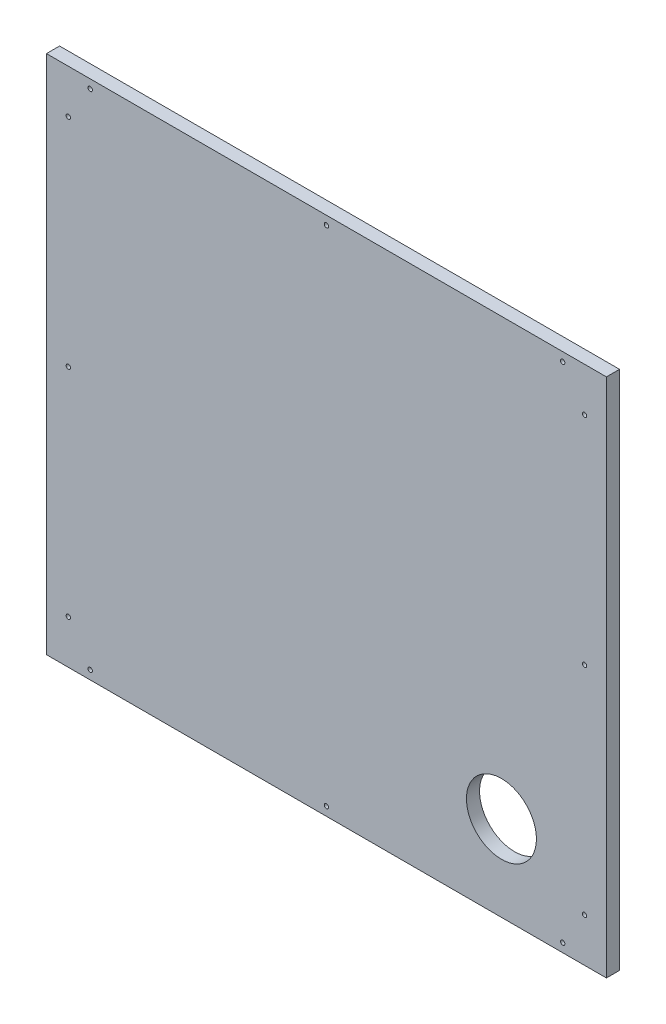
ISO-10303-21;
HEADER;
FILE_DESCRIPTION(('STEP AP214'),'2;1');
FILE_NAME('part.step','',(''),(''),'','','');
FILE_SCHEMA(('AUTOMOTIVE_DESIGN { 1 0 10303 214 1 1 1 1 }'));
ENDSEC;
DATA;
#1=APPLICATION_CONTEXT('core data for automotive mechanical design processes');
#2=APPLICATION_PROTOCOL_DEFINITION('international standard','automotive_design',2000,#1);
#3=PRODUCT_CONTEXT('',#1,'mechanical');
#4=PRODUCT('Part','Part','',(#3));
#5=PRODUCT_RELATED_PRODUCT_CATEGORY('part','',(#4));
#6=PRODUCT_DEFINITION_FORMATION('','',#4);
#7=PRODUCT_DEFINITION_CONTEXT('part definition',#1,'design');
#8=PRODUCT_DEFINITION('design','',#6,#7);
#9=PRODUCT_DEFINITION_SHAPE('','',#8);
#10=(LENGTH_UNIT() NAMED_UNIT(*) SI_UNIT(.MILLI.,.METRE.));
#11=(NAMED_UNIT(*) PLANE_ANGLE_UNIT() SI_UNIT($,.RADIAN.));
#12=(NAMED_UNIT(*) SI_UNIT($,.STERADIAN.) SOLID_ANGLE_UNIT());
#13=UNCERTAINTY_MEASURE_WITH_UNIT(LENGTH_MEASURE(1.E-05),#10,'distance_accuracy_value','');
#14=(GEOMETRIC_REPRESENTATION_CONTEXT(3) GLOBAL_UNCERTAINTY_ASSIGNED_CONTEXT((#13)) GLOBAL_UNIT_ASSIGNED_CONTEXT((#10,
#11,#12)) REPRESENTATION_CONTEXT('',''));
#15=CARTESIAN_POINT('',(0.,0.,0.));
#16=DIRECTION('',(0.,0.,1.));
#17=DIRECTION('',(1.,0.,0.));
#18=AXIS2_PLACEMENT_3D('',#15,#16,#17);
#19=CARTESIAN_POINT('',(320.,297.5,15.));
#20=DIRECTION('',(-1.,0.,0.));
#21=DIRECTION('',(0.,-1.,0.));
#22=AXIS2_PLACEMENT_3D('',#19,#20,#21);
#23=PLANE('',#22);
#24=DIRECTION('',(0.,1.,0.));
#25=VECTOR('',#24,1.);
#26=CARTESIAN_POINT('',(320.,297.5,0.));
#27=LINE('',#26,#25);
#28=CARTESIAN_POINT('',(320.,-297.5,0.));
#29=VERTEX_POINT('',#28);
#30=CARTESIAN_POINT('',(320.,297.5,0.));
#31=VERTEX_POINT('',#30);
#32=EDGE_CURVE('E100',#29,#31,#27,.T.);
#33=ORIENTED_EDGE('',*,*,#32,.T.);
#34=DIRECTION('',(0.,0.,-1.));
#35=VECTOR('',#34,1.);
#36=CARTESIAN_POINT('',(320.,297.5,15.));
#37=LINE('',#36,#35);
#38=CARTESIAN_POINT('',(320.,297.5,15.));
#39=VERTEX_POINT('',#38);
#40=EDGE_CURVE('E11',#39,#31,#37,.T.);
#41=ORIENTED_EDGE('',*,*,#40,.F.);
#42=DIRECTION('',(0.,1.,0.));
#43=VECTOR('',#42,1.);
#44=CARTESIAN_POINT('',(320.,297.5,15.));
#45=LINE('',#44,#43);
#46=CARTESIAN_POINT('',(320.,-297.5,15.));
#47=VERTEX_POINT('',#46);
#48=EDGE_CURVE('E88',#47,#39,#45,.T.);
#49=ORIENTED_EDGE('',*,*,#48,.F.);
#50=DIRECTION('',(0.,0.,-1.));
#51=VECTOR('',#50,1.);
#52=CARTESIAN_POINT('',(320.,-297.5,15.));
#53=LINE('',#52,#51);
#54=EDGE_CURVE('E96',#47,#29,#53,.T.);
#55=ORIENTED_EDGE('',*,*,#54,.T.);
#56=EDGE_LOOP('',(#33,#41,#49,#55));
#57=FACE_BOUND('',#56,.T.);
#58=ADVANCED_FACE('F37',(#57),#23,.F.);
#59=CARTESIAN_POINT('',(-320.,297.5,15.));
#60=DIRECTION('',(0.,-1.,0.));
#61=DIRECTION('',(0.,0.,-1.));
#62=AXIS2_PLACEMENT_3D('',#59,#60,#61);
#63=PLANE('',#62);
#64=DIRECTION('',(-1.,0.,0.));
#65=VECTOR('',#64,1.);
#66=CARTESIAN_POINT('',(-320.,297.5,0.));
#67=LINE('',#66,#65);
#68=CARTESIAN_POINT('',(-320.,297.5,0.));
#69=VERTEX_POINT('',#68);
#70=EDGE_CURVE('E92',#31,#69,#67,.T.);
#71=ORIENTED_EDGE('',*,*,#70,.T.);
#72=DIRECTION('',(0.,0.,-1.));
#73=VECTOR('',#72,1.);
#74=CARTESIAN_POINT('',(-320.,297.5,15.));
#75=LINE('',#74,#73);
#76=CARTESIAN_POINT('',(-320.,297.5,15.));
#77=VERTEX_POINT('',#76);
#78=EDGE_CURVE('E45',#77,#69,#75,.T.);
#79=ORIENTED_EDGE('',*,*,#78,.F.);
#80=DIRECTION('',(-1.,0.,0.));
#81=VECTOR('',#80,1.);
#82=CARTESIAN_POINT('',(-320.,297.5,15.));
#83=LINE('',#82,#81);
#84=EDGE_CURVE('E83',#39,#77,#83,.T.);
#85=ORIENTED_EDGE('',*,*,#84,.F.);
#86=ORIENTED_EDGE('',*,*,#40,.T.);
#87=EDGE_LOOP('',(#71,#79,#85,#86));
#88=FACE_BOUND('',#87,.T.);
#89=ADVANCED_FACE('F91',(#88),#63,.F.);
#90=CARTESIAN_POINT('',(-320.,297.5,15.));
#91=DIRECTION('',(1.,0.,0.));
#92=DIRECTION('',(0.,0.,-1.));
#93=AXIS2_PLACEMENT_3D('',#90,#91,#92);
#94=PLANE('',#93);
#95=DIRECTION('',(0.,-1.,0.));
#96=VECTOR('',#95,1.);
#97=CARTESIAN_POINT('',(-320.,297.5,0.));
#98=LINE('',#97,#96);
#99=CARTESIAN_POINT('',(-320.,-297.5,0.));
#100=VERTEX_POINT('',#99);
#101=EDGE_CURVE('E70',#69,#100,#98,.T.);
#102=ORIENTED_EDGE('',*,*,#101,.T.);
#103=DIRECTION('',(0.,0.,-1.));
#104=VECTOR('',#103,1.);
#105=CARTESIAN_POINT('',(-320.,-297.5,15.));
#106=LINE('',#105,#104);
#107=CARTESIAN_POINT('',(-320.,-297.5,15.));
#108=VERTEX_POINT('',#107);
#109=EDGE_CURVE('E93',#108,#100,#106,.T.);
#110=ORIENTED_EDGE('',*,*,#109,.F.);
#111=DIRECTION('',(0.,-1.,0.));
#112=VECTOR('',#111,1.);
#113=CARTESIAN_POINT('',(-320.,297.5,15.));
#114=LINE('',#113,#112);
#115=EDGE_CURVE('E86',#77,#108,#114,.T.);
#116=ORIENTED_EDGE('',*,*,#115,.F.);
#117=ORIENTED_EDGE('',*,*,#78,.T.);
#118=EDGE_LOOP('',(#102,#110,#116,#117));
#119=FACE_BOUND('',#118,.T.);
#120=ADVANCED_FACE('F94',(#119),#94,.F.);
#121=CARTESIAN_POINT('',(-320.,-297.5,15.));
#122=DIRECTION('',(0.,1.,0.));
#123=DIRECTION('',(0.,0.,1.));
#124=AXIS2_PLACEMENT_3D('',#121,#122,#123);
#125=PLANE('',#124);
#126=DIRECTION('',(1.,0.,0.));
#127=VECTOR('',#126,1.);
#128=CARTESIAN_POINT('',(-320.,-297.5,0.));
#129=LINE('',#128,#127);
#130=EDGE_CURVE('E76',#100,#29,#129,.T.);
#131=ORIENTED_EDGE('',*,*,#130,.T.);
#132=ORIENTED_EDGE('',*,*,#54,.F.);
#133=DIRECTION('',(1.,0.,0.));
#134=VECTOR('',#133,1.);
#135=CARTESIAN_POINT('',(-320.,-297.5,15.));
#136=LINE('',#135,#134);
#137=EDGE_CURVE('E53',#108,#47,#136,.T.);
#138=ORIENTED_EDGE('',*,*,#137,.F.);
#139=ORIENTED_EDGE('',*,*,#109,.T.);
#140=EDGE_LOOP('',(#131,#132,#138,#139));
#141=FACE_BOUND('',#140,.T.);
#142=ADVANCED_FACE('F108',(#141),#125,.F.);
#143=CARTESIAN_POINT('',(0.,0.,15.));
#144=DIRECTION('',(0.,0.,1.));
#145=DIRECTION('',(1.,0.,0.));
#146=AXIS2_PLACEMENT_3D('',#143,#144,#145);
#147=PLANE('',#146);
#148=CARTESIAN_POINT('',(200.,-200.,15.));
#149=DIRECTION('',(0.,0.,1.));
#150=DIRECTION('',(1.,0.,0.));
#151=AXIS2_PLACEMENT_3D('',#148,#149,#150);
#152=CIRCLE('',#151,40.);
#153=CARTESIAN_POINT('',(240.,-200.,15.));
#154=VERTEX_POINT('',#153);
#155=EDGE_CURVE('E186',#154,#154,#152,.T.);
#156=ORIENTED_EDGE('',*,*,#155,.F.);
#157=EDGE_LOOP('',(#156));
#158=FACE_BOUND('',#157,.T.);
#159=CARTESIAN_POINT('',(295.,247.5,15.));
#160=DIRECTION('',(0.,0.,-1.));
#161=DIRECTION('',(-1.,0.,0.));
#162=AXIS2_PLACEMENT_3D('',#159,#160,#161);
#163=CIRCLE('',#162,2.50000000000002);
#164=CARTESIAN_POINT('',(292.5,247.5,15.));
#165=VERTEX_POINT('',#164);
#166=EDGE_CURVE('E181',#165,#165,#163,.T.);
#167=ORIENTED_EDGE('',*,*,#166,.T.);
#168=EDGE_LOOP('',(#167));
#169=FACE_BOUND('',#168,.T.);
#170=CARTESIAN_POINT('',(295.,0.,15.));
#171=DIRECTION('',(0.,0.,-1.));
#172=DIRECTION('',(-1.,0.,0.));
#173=AXIS2_PLACEMENT_3D('',#170,#171,#172);
#174=CIRCLE('',#173,2.50000000000002);
#175=CARTESIAN_POINT('',(292.5,0.,15.));
#176=VERTEX_POINT('',#175);
#177=EDGE_CURVE('E175',#176,#176,#174,.T.);
#178=ORIENTED_EDGE('',*,*,#177,.T.);
#179=EDGE_LOOP('',(#178));
#180=FACE_BOUND('',#179,.T.);
#181=CARTESIAN_POINT('',(295.,-247.5,15.));
#182=DIRECTION('',(0.,0.,-1.));
#183=DIRECTION('',(-1.,0.,0.));
#184=AXIS2_PLACEMENT_3D('',#181,#182,#183);
#185=CIRCLE('',#184,2.50000000000002);
#186=CARTESIAN_POINT('',(292.5,-247.5,15.));
#187=VERTEX_POINT('',#186);
#188=EDGE_CURVE('E168',#187,#187,#185,.T.);
#189=ORIENTED_EDGE('',*,*,#188,.T.);
#190=EDGE_LOOP('',(#189));
#191=FACE_BOUND('',#190,.T.);
#192=CARTESIAN_POINT('',(-270.,-287.5,15.));
#193=DIRECTION('',(0.,0.,-1.));
#194=DIRECTION('',(1.,0.,0.));
#195=AXIS2_PLACEMENT_3D('',#192,#193,#194);
#196=CIRCLE('',#195,2.50000000000002);
#197=CARTESIAN_POINT('',(-267.5,-287.5,15.));
#198=VERTEX_POINT('',#197);
#199=EDGE_CURVE('E163',#198,#198,#196,.T.);
#200=ORIENTED_EDGE('',*,*,#199,.T.);
#201=EDGE_LOOP('',(#200));
#202=FACE_BOUND('',#201,.T.);
#203=CARTESIAN_POINT('',(0.,-287.5,15.));
#204=DIRECTION('',(0.,0.,-1.));
#205=DIRECTION('',(1.,0.,0.));
#206=AXIS2_PLACEMENT_3D('',#203,#204,#205);
#207=CIRCLE('',#206,2.5);
#208=CARTESIAN_POINT('',(2.5,-287.5,15.));
#209=VERTEX_POINT('',#208);
#210=EDGE_CURVE('E157',#209,#209,#207,.T.);
#211=ORIENTED_EDGE('',*,*,#210,.T.);
#212=EDGE_LOOP('',(#211));
#213=FACE_BOUND('',#212,.T.);
#214=CARTESIAN_POINT('',(270.,-287.5,15.));
#215=DIRECTION('',(0.,0.,-1.));
#216=DIRECTION('',(1.,0.,0.));
#217=AXIS2_PLACEMENT_3D('',#214,#215,#216);
#218=CIRCLE('',#217,2.50000000000002);
#219=CARTESIAN_POINT('',(272.5,-287.5,15.));
#220=VERTEX_POINT('',#219);
#221=EDGE_CURVE('E150',#220,#220,#218,.T.);
#222=ORIENTED_EDGE('',*,*,#221,.T.);
#223=EDGE_LOOP('',(#222));
#224=FACE_BOUND('',#223,.T.);
#225=CARTESIAN_POINT('',(-295.,247.5,15.));
#226=DIRECTION('',(0.,0.,1.));
#227=DIRECTION('',(1.,0.,0.));
#228=AXIS2_PLACEMENT_3D('',#225,#226,#227);
#229=CIRCLE('',#228,2.50000000000002);
#230=CARTESIAN_POINT('',(-292.5,247.5,15.));
#231=VERTEX_POINT('',#230);
#232=EDGE_CURVE('E145',#231,#231,#229,.T.);
#233=ORIENTED_EDGE('',*,*,#232,.F.);
#234=EDGE_LOOP('',(#233));
#235=FACE_BOUND('',#234,.T.);
#236=CARTESIAN_POINT('',(-295.,0.,15.));
#237=DIRECTION('',(0.,0.,1.));
#238=DIRECTION('',(1.,0.,0.));
#239=AXIS2_PLACEMENT_3D('',#236,#237,#238);
#240=CIRCLE('',#239,2.50000000000002);
#241=CARTESIAN_POINT('',(-292.5,0.,15.));
#242=VERTEX_POINT('',#241);
#243=EDGE_CURVE('E142',#242,#242,#240,.T.);
#244=ORIENTED_EDGE('',*,*,#243,.F.);
#245=EDGE_LOOP('',(#244));
#246=FACE_BOUND('',#245,.T.);
#247=CARTESIAN_POINT('',(-295.,-247.5,15.));
#248=DIRECTION('',(0.,0.,1.));
#249=DIRECTION('',(1.,0.,0.));
#250=AXIS2_PLACEMENT_3D('',#247,#248,#249);
#251=CIRCLE('',#250,2.50000000000002);
#252=CARTESIAN_POINT('',(-292.5,-247.5,15.));
#253=VERTEX_POINT('',#252);
#254=EDGE_CURVE('E135',#253,#253,#251,.T.);
#255=ORIENTED_EDGE('',*,*,#254,.F.);
#256=EDGE_LOOP('',(#255));
#257=FACE_BOUND('',#256,.T.);
#258=CARTESIAN_POINT('',(-270.,287.5,15.));
#259=DIRECTION('',(0.,0.,1.));
#260=DIRECTION('',(1.,0.,0.));
#261=AXIS2_PLACEMENT_3D('',#258,#259,#260);
#262=CIRCLE('',#261,2.50000000000002);
#263=CARTESIAN_POINT('',(-267.5,287.5,15.));
#264=VERTEX_POINT('',#263);
#265=EDGE_CURVE('E127',#264,#264,#262,.T.);
#266=ORIENTED_EDGE('',*,*,#265,.F.);
#267=EDGE_LOOP('',(#266));
#268=FACE_BOUND('',#267,.T.);
#269=CARTESIAN_POINT('',(0.,287.5,15.));
#270=DIRECTION('',(0.,0.,1.));
#271=DIRECTION('',(1.,0.,0.));
#272=AXIS2_PLACEMENT_3D('',#269,#270,#271);
#273=CIRCLE('',#272,2.5);
#274=CARTESIAN_POINT('',(2.5,287.5,15.));
#275=VERTEX_POINT('',#274);
#276=EDGE_CURVE('E124',#275,#275,#273,.T.);
#277=ORIENTED_EDGE('',*,*,#276,.F.);
#278=EDGE_LOOP('',(#277));
#279=FACE_BOUND('',#278,.T.);
#280=CARTESIAN_POINT('',(270.,287.5,15.));
#281=DIRECTION('',(0.,0.,1.));
#282=DIRECTION('',(1.,0.,0.));
#283=AXIS2_PLACEMENT_3D('',#280,#281,#282);
#284=CIRCLE('',#283,2.50000000000002);
#285=CARTESIAN_POINT('',(272.5,287.5,15.));
#286=VERTEX_POINT('',#285);
#287=EDGE_CURVE('E117',#286,#286,#284,.T.);
#288=ORIENTED_EDGE('',*,*,#287,.F.);
#289=EDGE_LOOP('',(#288));
#290=FACE_BOUND('',#289,.T.);
#291=ORIENTED_EDGE('',*,*,#48,.T.);
#292=ORIENTED_EDGE('',*,*,#84,.T.);
#293=ORIENTED_EDGE('',*,*,#115,.T.);
#294=ORIENTED_EDGE('',*,*,#137,.T.);
#295=EDGE_LOOP('',(#291,#292,#293,#294));
#296=FACE_BOUND('',#295,.T.);
#297=ADVANCED_FACE('F84',(#158,#169,#180,#191,#202,#213,#224,#235,#246,#257,#268,#279,#290,
#296),#147,.T.);
#298=CARTESIAN_POINT('',(0.,0.,0.));
#299=DIRECTION('',(0.,0.,1.));
#300=DIRECTION('',(1.,0.,0.));
#301=AXIS2_PLACEMENT_3D('',#298,#299,#300);
#302=PLANE('',#301);
#303=CARTESIAN_POINT('',(200.,-200.,0.));
#304=DIRECTION('',(0.,0.,1.));
#305=DIRECTION('',(1.,0.,0.));
#306=AXIS2_PLACEMENT_3D('',#303,#304,#305);
#307=CIRCLE('',#306,40.);
#308=CARTESIAN_POINT('',(240.,-200.,0.));
#309=VERTEX_POINT('',#308);
#310=EDGE_CURVE('E172',#309,#309,#307,.T.);
#311=ORIENTED_EDGE('',*,*,#310,.T.);
#312=EDGE_LOOP('',(#311));
#313=FACE_BOUND('',#312,.T.);
#314=CARTESIAN_POINT('',(295.,247.5,0.));
#315=DIRECTION('',(0.,0.,-1.));
#316=DIRECTION('',(-1.,0.,0.));
#317=AXIS2_PLACEMENT_3D('',#314,#315,#316);
#318=CIRCLE('',#317,2.50000000000002);
#319=CARTESIAN_POINT('',(292.5,247.5,0.));
#320=VERTEX_POINT('',#319);
#321=EDGE_CURVE('E154',#320,#320,#318,.T.);
#322=ORIENTED_EDGE('',*,*,#321,.F.);
#323=EDGE_LOOP('',(#322));
#324=FACE_BOUND('',#323,.T.);
#325=CARTESIAN_POINT('',(295.,0.,0.));
#326=DIRECTION('',(0.,0.,-1.));
#327=DIRECTION('',(-1.,0.,0.));
#328=AXIS2_PLACEMENT_3D('',#325,#326,#327);
#329=CIRCLE('',#328,2.50000000000002);
#330=CARTESIAN_POINT('',(292.5,0.,0.));
#331=VERTEX_POINT('',#330);
#332=EDGE_CURVE('E178',#331,#331,#329,.T.);
#333=ORIENTED_EDGE('',*,*,#332,.F.);
#334=EDGE_LOOP('',(#333));
#335=FACE_BOUND('',#334,.T.);
#336=CARTESIAN_POINT('',(295.,-247.5,0.));
#337=DIRECTION('',(0.,0.,-1.));
#338=DIRECTION('',(-1.,0.,0.));
#339=AXIS2_PLACEMENT_3D('',#336,#337,#338);
#340=CIRCLE('',#339,2.50000000000002);
#341=CARTESIAN_POINT('',(292.5,-247.5,0.));
#342=VERTEX_POINT('',#341);
#343=EDGE_CURVE('E171',#342,#342,#340,.T.);
#344=ORIENTED_EDGE('',*,*,#343,.F.);
#345=EDGE_LOOP('',(#344));
#346=FACE_BOUND('',#345,.T.);
#347=CARTESIAN_POINT('',(-270.,-287.5,0.));
#348=DIRECTION('',(0.,0.,-1.));
#349=DIRECTION('',(1.,0.,0.));
#350=AXIS2_PLACEMENT_3D('',#347,#348,#349);
#351=CIRCLE('',#350,2.50000000000002);
#352=CARTESIAN_POINT('',(-267.5,-287.5,0.));
#353=VERTEX_POINT('',#352);
#354=EDGE_CURVE('E136',#353,#353,#351,.T.);
#355=ORIENTED_EDGE('',*,*,#354,.F.);
#356=EDGE_LOOP('',(#355));
#357=FACE_BOUND('',#356,.T.);
#358=CARTESIAN_POINT('',(0.,-287.5,0.));
#359=DIRECTION('',(0.,0.,-1.));
#360=DIRECTION('',(1.,0.,0.));
#361=AXIS2_PLACEMENT_3D('',#358,#359,#360);
#362=CIRCLE('',#361,2.5);
#363=CARTESIAN_POINT('',(2.5,-287.5,0.));
#364=VERTEX_POINT('',#363);
#365=EDGE_CURVE('E160',#364,#364,#362,.T.);
#366=ORIENTED_EDGE('',*,*,#365,.F.);
#367=EDGE_LOOP('',(#366));
#368=FACE_BOUND('',#367,.T.);
#369=CARTESIAN_POINT('',(270.,-287.5,0.));
#370=DIRECTION('',(0.,0.,-1.));
#371=DIRECTION('',(1.,0.,0.));
#372=AXIS2_PLACEMENT_3D('',#369,#370,#371);
#373=CIRCLE('',#372,2.50000000000002);
#374=CARTESIAN_POINT('',(272.5,-287.5,0.));
#375=VERTEX_POINT('',#374);
#376=EDGE_CURVE('E153',#375,#375,#373,.T.);
#377=ORIENTED_EDGE('',*,*,#376,.F.);
#378=EDGE_LOOP('',(#377));
#379=FACE_BOUND('',#378,.T.);
#380=CARTESIAN_POINT('',(-295.,247.5,0.));
#381=DIRECTION('',(0.,0.,1.));
#382=DIRECTION('',(1.,0.,0.));
#383=AXIS2_PLACEMENT_3D('',#380,#381,#382);
#384=CIRCLE('',#383,2.50000000000002);
#385=CARTESIAN_POINT('',(-292.5,247.5,0.));
#386=VERTEX_POINT('',#385);
#387=EDGE_CURVE('E118',#386,#386,#384,.T.);
#388=ORIENTED_EDGE('',*,*,#387,.T.);
#389=EDGE_LOOP('',(#388));
#390=FACE_BOUND('',#389,.T.);
#391=CARTESIAN_POINT('',(-295.,0.,0.));
#392=DIRECTION('',(0.,0.,1.));
#393=DIRECTION('',(1.,0.,0.));
#394=AXIS2_PLACEMENT_3D('',#391,#392,#393);
#395=CIRCLE('',#394,2.50000000000002);
#396=CARTESIAN_POINT('',(-292.5,0.,0.));
#397=VERTEX_POINT('',#396);
#398=EDGE_CURVE('E139',#397,#397,#395,.T.);
#399=ORIENTED_EDGE('',*,*,#398,.T.);
#400=EDGE_LOOP('',(#399));
#401=FACE_BOUND('',#400,.T.);
#402=CARTESIAN_POINT('',(-295.,-247.5,0.));
#403=DIRECTION('',(0.,0.,1.));
#404=DIRECTION('',(1.,0.,0.));
#405=AXIS2_PLACEMENT_3D('',#402,#403,#404);
#406=CIRCLE('',#405,2.50000000000002);
#407=CARTESIAN_POINT('',(-292.5,-247.5,0.));
#408=VERTEX_POINT('',#407);
#409=EDGE_CURVE('E132',#408,#408,#406,.T.);
#410=ORIENTED_EDGE('',*,*,#409,.T.);
#411=EDGE_LOOP('',(#410));
#412=FACE_BOUND('',#411,.T.);
#413=CARTESIAN_POINT('',(-270.,287.5,0.));
#414=DIRECTION('',(0.,0.,1.));
#415=DIRECTION('',(1.,0.,0.));
#416=AXIS2_PLACEMENT_3D('',#413,#414,#415);
#417=CIRCLE('',#416,2.50000000000002);
#418=CARTESIAN_POINT('',(-267.5,287.5,0.));
#419=VERTEX_POINT('',#418);
#420=EDGE_CURVE('E103',#419,#419,#417,.T.);
#421=ORIENTED_EDGE('',*,*,#420,.T.);
#422=EDGE_LOOP('',(#421));
#423=FACE_BOUND('',#422,.T.);
#424=CARTESIAN_POINT('',(0.,287.5,0.));
#425=DIRECTION('',(0.,0.,1.));
#426=DIRECTION('',(1.,0.,0.));
#427=AXIS2_PLACEMENT_3D('',#424,#425,#426);
#428=CIRCLE('',#427,2.5);
#429=CARTESIAN_POINT('',(2.5,287.5,0.));
#430=VERTEX_POINT('',#429);
#431=EDGE_CURVE('E121',#430,#430,#428,.T.);
#432=ORIENTED_EDGE('',*,*,#431,.T.);
#433=EDGE_LOOP('',(#432));
#434=FACE_BOUND('',#433,.T.);
#435=CARTESIAN_POINT('',(270.,287.5,0.));
#436=DIRECTION('',(0.,0.,1.));
#437=DIRECTION('',(1.,0.,0.));
#438=AXIS2_PLACEMENT_3D('',#435,#436,#437);
#439=CIRCLE('',#438,2.50000000000002);
#440=CARTESIAN_POINT('',(272.5,287.5,0.));
#441=VERTEX_POINT('',#440);
#442=EDGE_CURVE('E114',#441,#441,#439,.T.);
#443=ORIENTED_EDGE('',*,*,#442,.T.);
#444=EDGE_LOOP('',(#443));
#445=FACE_BOUND('',#444,.T.);
#446=ORIENTED_EDGE('',*,*,#32,.F.);
#447=ORIENTED_EDGE('',*,*,#130,.F.);
#448=ORIENTED_EDGE('',*,*,#101,.F.);
#449=ORIENTED_EDGE('',*,*,#70,.F.);
#450=EDGE_LOOP('',(#446,#447,#448,#449));
#451=FACE_BOUND('',#450,.T.);
#452=ADVANCED_FACE('F111',(#313,#324,#335,#346,#357,#368,#379,#390,#401,#412,#423,#434,#445,
#451),#302,.F.);
#453=CARTESIAN_POINT('',(270.,287.5,0.));
#454=DIRECTION('',(0.,0.,1.));
#455=DIRECTION('',(1.,0.,0.));
#456=AXIS2_PLACEMENT_3D('',#453,#454,#455);
#457=CYLINDRICAL_SURFACE('',#456,2.50000000000002);
#458=ORIENTED_EDGE('',*,*,#442,.F.);
#459=EDGE_LOOP('',(#458));
#460=FACE_BOUND('',#459,.T.);
#461=ORIENTED_EDGE('',*,*,#287,.T.);
#462=EDGE_LOOP('',(#461));
#463=FACE_BOUND('',#462,.T.);
#464=ADVANCED_FACE('F228',(#460,#463),#457,.F.);
#465=CARTESIAN_POINT('',(0.,287.5,0.));
#466=DIRECTION('',(0.,0.,1.));
#467=DIRECTION('',(1.,0.,0.));
#468=AXIS2_PLACEMENT_3D('',#465,#466,#467);
#469=CYLINDRICAL_SURFACE('',#468,2.5);
#470=ORIENTED_EDGE('',*,*,#431,.F.);
#471=EDGE_LOOP('',(#470));
#472=FACE_BOUND('',#471,.T.);
#473=ORIENTED_EDGE('',*,*,#276,.T.);
#474=EDGE_LOOP('',(#473));
#475=FACE_BOUND('',#474,.T.);
#476=ADVANCED_FACE('F230',(#472,#475),#469,.F.);
#477=CARTESIAN_POINT('',(-270.,287.5,0.));
#478=DIRECTION('',(0.,0.,1.));
#479=DIRECTION('',(1.,0.,0.));
#480=AXIS2_PLACEMENT_3D('',#477,#478,#479);
#481=CYLINDRICAL_SURFACE('',#480,2.50000000000002);
#482=ORIENTED_EDGE('',*,*,#420,.F.);
#483=EDGE_LOOP('',(#482));
#484=FACE_BOUND('',#483,.T.);
#485=ORIENTED_EDGE('',*,*,#265,.T.);
#486=EDGE_LOOP('',(#485));
#487=FACE_BOUND('',#486,.T.);
#488=ADVANCED_FACE('F237',(#484,#487),#481,.F.);
#489=CARTESIAN_POINT('',(-295.,-247.5,0.));
#490=DIRECTION('',(0.,0.,1.));
#491=DIRECTION('',(1.,0.,0.));
#492=AXIS2_PLACEMENT_3D('',#489,#490,#491);
#493=CYLINDRICAL_SURFACE('',#492,2.50000000000002);
#494=ORIENTED_EDGE('',*,*,#409,.F.);
#495=EDGE_LOOP('',(#494));
#496=FACE_BOUND('',#495,.T.);
#497=ORIENTED_EDGE('',*,*,#254,.T.);
#498=EDGE_LOOP('',(#497));
#499=FACE_BOUND('',#498,.T.);
#500=ADVANCED_FACE('F337',(#496,#499),#493,.F.);
#501=CARTESIAN_POINT('',(-295.,0.,0.));
#502=DIRECTION('',(0.,0.,1.));
#503=DIRECTION('',(1.,0.,0.));
#504=AXIS2_PLACEMENT_3D('',#501,#502,#503);
#505=CYLINDRICAL_SURFACE('',#504,2.50000000000002);
#506=ORIENTED_EDGE('',*,*,#398,.F.);
#507=EDGE_LOOP('',(#506));
#508=FACE_BOUND('',#507,.T.);
#509=ORIENTED_EDGE('',*,*,#243,.T.);
#510=EDGE_LOOP('',(#509));
#511=FACE_BOUND('',#510,.T.);
#512=ADVANCED_FACE('F329',(#508,#511),#505,.F.);
#513=CARTESIAN_POINT('',(-295.,247.5,0.));
#514=DIRECTION('',(0.,0.,1.));
#515=DIRECTION('',(1.,0.,0.));
#516=AXIS2_PLACEMENT_3D('',#513,#514,#515);
#517=CYLINDRICAL_SURFACE('',#516,2.50000000000002);
#518=ORIENTED_EDGE('',*,*,#387,.F.);
#519=EDGE_LOOP('',(#518));
#520=FACE_BOUND('',#519,.T.);
#521=ORIENTED_EDGE('',*,*,#232,.T.);
#522=EDGE_LOOP('',(#521));
#523=FACE_BOUND('',#522,.T.);
#524=ADVANCED_FACE('F321',(#520,#523),#517,.F.);
#525=CARTESIAN_POINT('',(270.,-287.5,0.));
#526=DIRECTION('',(0.,0.,1.));
#527=DIRECTION('',(1.,0.,0.));
#528=AXIS2_PLACEMENT_3D('',#525,#526,#527);
#529=CYLINDRICAL_SURFACE('',#528,2.50000000000002);
#530=ORIENTED_EDGE('',*,*,#376,.T.);
#531=EDGE_LOOP('',(#530));
#532=FACE_BOUND('',#531,.T.);
#533=ORIENTED_EDGE('',*,*,#221,.F.);
#534=EDGE_LOOP('',(#533));
#535=FACE_BOUND('',#534,.T.);
#536=ADVANCED_FACE('F313',(#532,#535),#529,.F.);
#537=CARTESIAN_POINT('',(0.,-287.5,0.));
#538=DIRECTION('',(0.,0.,1.));
#539=DIRECTION('',(1.,0.,0.));
#540=AXIS2_PLACEMENT_3D('',#537,#538,#539);
#541=CYLINDRICAL_SURFACE('',#540,2.5);
#542=ORIENTED_EDGE('',*,*,#365,.T.);
#543=EDGE_LOOP('',(#542));
#544=FACE_BOUND('',#543,.T.);
#545=ORIENTED_EDGE('',*,*,#210,.F.);
#546=EDGE_LOOP('',(#545));
#547=FACE_BOUND('',#546,.T.);
#548=ADVANCED_FACE('F305',(#544,#547),#541,.F.);
#549=CARTESIAN_POINT('',(-270.,-287.5,0.));
#550=DIRECTION('',(0.,0.,1.));
#551=DIRECTION('',(1.,0.,0.));
#552=AXIS2_PLACEMENT_3D('',#549,#550,#551);
#553=CYLINDRICAL_SURFACE('',#552,2.50000000000002);
#554=ORIENTED_EDGE('',*,*,#354,.T.);
#555=EDGE_LOOP('',(#554));
#556=FACE_BOUND('',#555,.T.);
#557=ORIENTED_EDGE('',*,*,#199,.F.);
#558=EDGE_LOOP('',(#557));
#559=FACE_BOUND('',#558,.T.);
#560=ADVANCED_FACE('F297',(#556,#559),#553,.F.);
#561=CARTESIAN_POINT('',(295.,-247.5,0.));
#562=DIRECTION('',(0.,0.,1.));
#563=DIRECTION('',(1.,0.,0.));
#564=AXIS2_PLACEMENT_3D('',#561,#562,#563);
#565=CYLINDRICAL_SURFACE('',#564,2.50000000000002);
#566=ORIENTED_EDGE('',*,*,#343,.T.);
#567=EDGE_LOOP('',(#566));
#568=FACE_BOUND('',#567,.T.);
#569=ORIENTED_EDGE('',*,*,#188,.F.);
#570=EDGE_LOOP('',(#569));
#571=FACE_BOUND('',#570,.T.);
#572=ADVANCED_FACE('F289',(#568,#571),#565,.F.);
#573=CARTESIAN_POINT('',(295.,0.,0.));
#574=DIRECTION('',(0.,0.,1.));
#575=DIRECTION('',(1.,0.,0.));
#576=AXIS2_PLACEMENT_3D('',#573,#574,#575);
#577=CYLINDRICAL_SURFACE('',#576,2.50000000000002);
#578=ORIENTED_EDGE('',*,*,#332,.T.);
#579=EDGE_LOOP('',(#578));
#580=FACE_BOUND('',#579,.T.);
#581=ORIENTED_EDGE('',*,*,#177,.F.);
#582=EDGE_LOOP('',(#581));
#583=FACE_BOUND('',#582,.T.);
#584=ADVANCED_FACE('F282',(#580,#583),#577,.F.);
#585=CARTESIAN_POINT('',(295.,247.5,0.));
#586=DIRECTION('',(0.,0.,1.));
#587=DIRECTION('',(1.,0.,0.));
#588=AXIS2_PLACEMENT_3D('',#585,#586,#587);
#589=CYLINDRICAL_SURFACE('',#588,2.50000000000002);
#590=ORIENTED_EDGE('',*,*,#321,.T.);
#591=EDGE_LOOP('',(#590));
#592=FACE_BOUND('',#591,.T.);
#593=ORIENTED_EDGE('',*,*,#166,.F.);
#594=EDGE_LOOP('',(#593));
#595=FACE_BOUND('',#594,.T.);
#596=ADVANCED_FACE('F197',(#592,#595),#589,.F.);
#597=CARTESIAN_POINT('',(200.,-200.,0.));
#598=DIRECTION('',(0.,0.,1.));
#599=DIRECTION('',(1.,0.,0.));
#600=AXIS2_PLACEMENT_3D('',#597,#598,#599);
#601=CYLINDRICAL_SURFACE('',#600,40.);
#602=ORIENTED_EDGE('',*,*,#310,.F.);
#603=EDGE_LOOP('',(#602));
#604=FACE_BOUND('',#603,.T.);
#605=ORIENTED_EDGE('',*,*,#155,.T.);
#606=EDGE_LOOP('',(#605));
#607=FACE_BOUND('',#606,.T.);
#608=ADVANCED_FACE('F194',(#604,#607),#601,.F.);
#609=CLOSED_SHELL('',(#58,#89,#120,#142,#297,#452,#464,#476,#488,#500,#512,#524,#536,#548,#560,
#572,#584,#596,#608));
#610=MANIFOLD_SOLID_BREP('B2',#609);
#611=ADVANCED_BREP_SHAPE_REPRESENTATION('',(#18,#610),#14);
#612=SHAPE_DEFINITION_REPRESENTATION(#9,#611);
ENDSEC;
END-ISO-10303-21;
